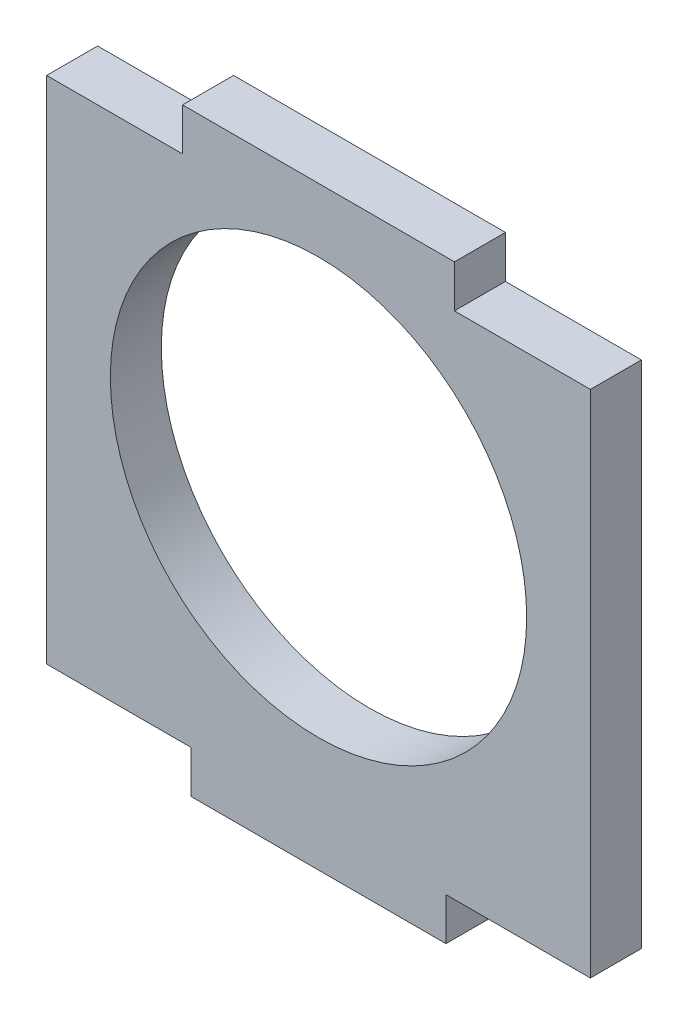
ISO-10303-21;
HEADER;
FILE_DESCRIPTION(('STEP AP214'),'2;1');
FILE_NAME('part.step','',(''),(''),'','','');
FILE_SCHEMA(('AUTOMOTIVE_DESIGN { 1 0 10303 214 1 1 1 1 }'));
ENDSEC;
DATA;
#1=APPLICATION_CONTEXT('core data for automotive mechanical design processes');
#2=APPLICATION_PROTOCOL_DEFINITION('international standard','automotive_design',2000,#1);
#3=PRODUCT_CONTEXT('',#1,'mechanical');
#4=PRODUCT('Part','Part','',(#3));
#5=PRODUCT_RELATED_PRODUCT_CATEGORY('part','',(#4));
#6=PRODUCT_DEFINITION_FORMATION('','',#4);
#7=PRODUCT_DEFINITION_CONTEXT('part definition',#1,'design');
#8=PRODUCT_DEFINITION('design','',#6,#7);
#9=PRODUCT_DEFINITION_SHAPE('','',#8);
#10=(LENGTH_UNIT() NAMED_UNIT(*) SI_UNIT(.MILLI.,.METRE.));
#11=(NAMED_UNIT(*) PLANE_ANGLE_UNIT() SI_UNIT($,.RADIAN.));
#12=(NAMED_UNIT(*) SI_UNIT($,.STERADIAN.) SOLID_ANGLE_UNIT());
#13=UNCERTAINTY_MEASURE_WITH_UNIT(LENGTH_MEASURE(1.E-05),#10,'distance_accuracy_value','');
#14=(GEOMETRIC_REPRESENTATION_CONTEXT(3) GLOBAL_UNCERTAINTY_ASSIGNED_CONTEXT((#13)) GLOBAL_UNIT_ASSIGNED_CONTEXT((#10,
#11,#12)) REPRESENTATION_CONTEXT('',''));
#15=CARTESIAN_POINT('',(0.,0.,0.));
#16=DIRECTION('',(0.,0.,1.));
#17=DIRECTION('',(1.,0.,0.));
#18=AXIS2_PLACEMENT_3D('',#15,#16,#17);
#19=CARTESIAN_POINT('',(0.,0.,3.));
#20=DIRECTION('',(0.,0.,-1.));
#21=DIRECTION('',(-1.,0.,0.));
#22=AXIS2_PLACEMENT_3D('',#19,#20,#21);
#23=PLANE('',#22);
#24=DIRECTION('',(0.,-1.,0.));
#25=VECTOR('',#24,1.);
#26=CARTESIAN_POINT('',(-16.,-15.0000000000005,3.));
#27=LINE('',#26,#25);
#28=CARTESIAN_POINT('',(-16.,14.9999999999996,3.));
#29=VERTEX_POINT('',#28);
#30=CARTESIAN_POINT('',(-16.,-15.0000000000005,3.));
#31=VERTEX_POINT('',#30);
#32=EDGE_CURVE('E177',#29,#31,#27,.T.);
#33=ORIENTED_EDGE('',*,*,#32,.T.);
#34=DIRECTION('',(1.,0.,0.));
#35=VECTOR('',#34,1.);
#36=CARTESIAN_POINT('',(-7.50000000000006,-15.0000000000005,3.));
#37=LINE('',#36,#35);
#38=CARTESIAN_POINT('',(-7.50000000000006,-15.0000000000005,3.));
#39=VERTEX_POINT('',#38);
#40=EDGE_CURVE('E105',#31,#39,#37,.T.);
#41=ORIENTED_EDGE('',*,*,#40,.T.);
#42=DIRECTION('',(0.,-1.,0.));
#43=VECTOR('',#42,1.);
#44=CARTESIAN_POINT('',(-7.50000000000007,-17.5000000000001,3.));
#45=LINE('',#44,#43);
#46=CARTESIAN_POINT('',(-7.50000000000007,-17.5000000000001,3.));
#47=VERTEX_POINT('',#46);
#48=EDGE_CURVE('E204',#39,#47,#45,.T.);
#49=ORIENTED_EDGE('',*,*,#48,.T.);
#50=DIRECTION('',(1.,0.,0.));
#51=VECTOR('',#50,1.);
#52=CARTESIAN_POINT('',(7.49999999999984,-17.5000000000001,3.));
#53=LINE('',#52,#51);
#54=CARTESIAN_POINT('',(7.49999999999984,-17.5000000000001,3.));
#55=VERTEX_POINT('',#54);
#56=EDGE_CURVE('E223',#47,#55,#53,.T.);
#57=ORIENTED_EDGE('',*,*,#56,.T.);
#58=DIRECTION('',(0.,1.,0.));
#59=VECTOR('',#58,1.);
#60=CARTESIAN_POINT('',(7.49999999999984,-17.5000000000001,3.));
#61=LINE('',#60,#59);
#62=CARTESIAN_POINT('',(7.49999999999984,-15.0000000000005,3.));
#63=VERTEX_POINT('',#62);
#64=EDGE_CURVE('E220',#55,#63,#61,.T.);
#65=ORIENTED_EDGE('',*,*,#64,.T.);
#66=DIRECTION('',(1.,0.,0.));
#67=VECTOR('',#66,1.);
#68=CARTESIAN_POINT('',(16.,-15.0000000000005,3.));
#69=LINE('',#68,#67);
#70=CARTESIAN_POINT('',(16.,-15.0000000000005,3.));
#71=VERTEX_POINT('',#70);
#72=EDGE_CURVE('E222',#63,#71,#69,.T.);
#73=ORIENTED_EDGE('',*,*,#72,.T.);
#74=DIRECTION('',(0.,1.,0.));
#75=VECTOR('',#74,1.);
#76=CARTESIAN_POINT('',(16.,14.9999999999996,3.));
#77=LINE('',#76,#75);
#78=CARTESIAN_POINT('',(16.,14.9999999999996,3.));
#79=VERTEX_POINT('',#78);
#80=EDGE_CURVE('E225',#71,#79,#77,.T.);
#81=ORIENTED_EDGE('',*,*,#80,.T.);
#82=DIRECTION('',(-1.,0.,0.));
#83=VECTOR('',#82,1.);
#84=CARTESIAN_POINT('',(8.00000000000001,14.9999999999996,3.));
#85=LINE('',#84,#83);
#86=CARTESIAN_POINT('',(8.00000000000001,14.9999999999996,3.));
#87=VERTEX_POINT('',#86);
#88=EDGE_CURVE('E231',#79,#87,#85,.T.);
#89=ORIENTED_EDGE('',*,*,#88,.T.);
#90=DIRECTION('',(0.,1.,0.));
#91=VECTOR('',#90,1.);
#92=CARTESIAN_POINT('',(8.00000000000001,17.5,3.));
#93=LINE('',#92,#91);
#94=CARTESIAN_POINT('',(8.00000000000001,17.5,3.));
#95=VERTEX_POINT('',#94);
#96=EDGE_CURVE('E136',#87,#95,#93,.T.);
#97=ORIENTED_EDGE('',*,*,#96,.T.);
#98=DIRECTION('',(-1.,0.,0.));
#99=VECTOR('',#98,1.);
#100=CARTESIAN_POINT('',(-8.00000000000001,17.5,3.));
#101=LINE('',#100,#99);
#102=CARTESIAN_POINT('',(-8.00000000000001,17.5,3.));
#103=VERTEX_POINT('',#102);
#104=EDGE_CURVE('E130',#95,#103,#101,.T.);
#105=ORIENTED_EDGE('',*,*,#104,.T.);
#106=DIRECTION('',(0.,-1.,0.));
#107=VECTOR('',#106,1.);
#108=CARTESIAN_POINT('',(-8.00000000000001,17.5,3.));
#109=LINE('',#108,#107);
#110=CARTESIAN_POINT('',(-8.00000000000001,14.9999999999996,3.));
#111=VERTEX_POINT('',#110);
#112=EDGE_CURVE('E134',#103,#111,#109,.T.);
#113=ORIENTED_EDGE('',*,*,#112,.T.);
#114=DIRECTION('',(-1.,0.,0.));
#115=VECTOR('',#114,1.);
#116=CARTESIAN_POINT('',(-16.,14.9999999999996,3.));
#117=LINE('',#116,#115);
#118=EDGE_CURVE('E50',#111,#29,#117,.T.);
#119=ORIENTED_EDGE('',*,*,#118,.T.);
#120=EDGE_LOOP('',(#33,#41,#49,#57,#65,#73,#81,#89,#97,#105,#113,#119));
#121=FACE_BOUND('',#120,.T.);
#122=CARTESIAN_POINT('',(0.,1.4999999999995,3.));
#123=DIRECTION('',(0.,0.,1.));
#124=DIRECTION('',(1.,0.,0.));
#125=AXIS2_PLACEMENT_3D('',#122,#123,#124);
#126=CIRCLE('',#125,12.2500000000001);
#127=CARTESIAN_POINT('',(12.2500000000001,1.4999999999995,3.));
#128=VERTEX_POINT('',#127);
#129=EDGE_CURVE('E158',#128,#128,#126,.T.);
#130=ORIENTED_EDGE('',*,*,#129,.F.);
#131=EDGE_LOOP('',(#130));
#132=FACE_BOUND('',#131,.T.);
#133=ADVANCED_FACE('F33',(#121,#132),#23,.F.);
#134=CARTESIAN_POINT('',(0.,0.,0.));
#135=DIRECTION('',(0.,0.,-1.));
#136=DIRECTION('',(-1.,0.,0.));
#137=AXIS2_PLACEMENT_3D('',#134,#135,#136);
#138=PLANE('',#137);
#139=DIRECTION('',(0.,-1.,0.));
#140=VECTOR('',#139,1.);
#141=CARTESIAN_POINT('',(-16.,-15.0000000000005,0.));
#142=LINE('',#141,#140);
#143=CARTESIAN_POINT('',(-16.,14.9999999999996,0.));
#144=VERTEX_POINT('',#143);
#145=CARTESIAN_POINT('',(-16.,-15.0000000000005,0.));
#146=VERTEX_POINT('',#145);
#147=EDGE_CURVE('E154',#144,#146,#142,.T.);
#148=ORIENTED_EDGE('',*,*,#147,.F.);
#149=DIRECTION('',(-1.,0.,0.));
#150=VECTOR('',#149,1.);
#151=CARTESIAN_POINT('',(-16.,14.9999999999996,0.));
#152=LINE('',#151,#150);
#153=CARTESIAN_POINT('',(-8.00000000000001,14.9999999999996,0.));
#154=VERTEX_POINT('',#153);
#155=EDGE_CURVE('E97',#154,#144,#152,.T.);
#156=ORIENTED_EDGE('',*,*,#155,.F.);
#157=DIRECTION('',(0.,-1.,0.));
#158=VECTOR('',#157,1.);
#159=CARTESIAN_POINT('',(-8.00000000000001,17.5,0.));
#160=LINE('',#159,#158);
#161=CARTESIAN_POINT('',(-8.00000000000001,17.5,0.));
#162=VERTEX_POINT('',#161);
#163=EDGE_CURVE('E91',#162,#154,#160,.T.);
#164=ORIENTED_EDGE('',*,*,#163,.F.);
#165=DIRECTION('',(-1.,0.,0.));
#166=VECTOR('',#165,1.);
#167=CARTESIAN_POINT('',(-8.00000000000001,17.5,0.));
#168=LINE('',#167,#166);
#169=CARTESIAN_POINT('',(8.00000000000001,17.5,0.));
#170=VERTEX_POINT('',#169);
#171=EDGE_CURVE('E144',#170,#162,#168,.T.);
#172=ORIENTED_EDGE('',*,*,#171,.F.);
#173=DIRECTION('',(0.,1.,0.));
#174=VECTOR('',#173,1.);
#175=CARTESIAN_POINT('',(8.00000000000001,17.5,0.));
#176=LINE('',#175,#174);
#177=CARTESIAN_POINT('',(8.00000000000001,14.9999999999996,0.));
#178=VERTEX_POINT('',#177);
#179=EDGE_CURVE('E172',#178,#170,#176,.T.);
#180=ORIENTED_EDGE('',*,*,#179,.F.);
#181=DIRECTION('',(-1.,0.,0.));
#182=VECTOR('',#181,1.);
#183=CARTESIAN_POINT('',(8.00000000000001,14.9999999999996,0.));
#184=LINE('',#183,#182);
#185=CARTESIAN_POINT('',(16.,14.9999999999996,0.));
#186=VERTEX_POINT('',#185);
#187=EDGE_CURVE('E170',#186,#178,#184,.T.);
#188=ORIENTED_EDGE('',*,*,#187,.F.);
#189=DIRECTION('',(0.,1.,0.));
#190=VECTOR('',#189,1.);
#191=CARTESIAN_POINT('',(16.,14.9999999999996,0.));
#192=LINE('',#191,#190);
#193=CARTESIAN_POINT('',(16.,-15.0000000000005,0.));
#194=VERTEX_POINT('',#193);
#195=EDGE_CURVE('E168',#194,#186,#192,.T.);
#196=ORIENTED_EDGE('',*,*,#195,.F.);
#197=DIRECTION('',(1.,0.,0.));
#198=VECTOR('',#197,1.);
#199=CARTESIAN_POINT('',(16.,-15.0000000000005,0.));
#200=LINE('',#199,#198);
#201=CARTESIAN_POINT('',(7.49999999999984,-15.0000000000005,0.));
#202=VERTEX_POINT('',#201);
#203=EDGE_CURVE('E166',#202,#194,#200,.T.);
#204=ORIENTED_EDGE('',*,*,#203,.F.);
#205=DIRECTION('',(0.,1.,0.));
#206=VECTOR('',#205,1.);
#207=CARTESIAN_POINT('',(7.49999999999984,-17.5000000000001,0.));
#208=LINE('',#207,#206);
#209=CARTESIAN_POINT('',(7.49999999999984,-17.5000000000001,0.));
#210=VERTEX_POINT('',#209);
#211=EDGE_CURVE('E164',#210,#202,#208,.T.);
#212=ORIENTED_EDGE('',*,*,#211,.F.);
#213=DIRECTION('',(1.,0.,0.));
#214=VECTOR('',#213,1.);
#215=CARTESIAN_POINT('',(7.49999999999984,-17.5000000000001,0.));
#216=LINE('',#215,#214);
#217=CARTESIAN_POINT('',(-7.50000000000007,-17.5000000000001,0.));
#218=VERTEX_POINT('',#217);
#219=EDGE_CURVE('E162',#218,#210,#216,.T.);
#220=ORIENTED_EDGE('',*,*,#219,.F.);
#221=DIRECTION('',(0.,-1.,0.));
#222=VECTOR('',#221,1.);
#223=CARTESIAN_POINT('',(-7.50000000000007,-17.5000000000001,0.));
#224=LINE('',#223,#222);
#225=CARTESIAN_POINT('',(-7.50000000000006,-15.0000000000005,0.));
#226=VERTEX_POINT('',#225);
#227=EDGE_CURVE('E160',#226,#218,#224,.T.);
#228=ORIENTED_EDGE('',*,*,#227,.F.);
#229=DIRECTION('',(1.,0.,0.));
#230=VECTOR('',#229,1.);
#231=CARTESIAN_POINT('',(-7.50000000000006,-15.0000000000005,0.));
#232=LINE('',#231,#230);
#233=EDGE_CURVE('E157',#146,#226,#232,.T.);
#234=ORIENTED_EDGE('',*,*,#233,.F.);
#235=EDGE_LOOP('',(#148,#156,#164,#172,#180,#188,#196,#204,#212,#220,#228,#234));
#236=FACE_BOUND('',#235,.T.);
#237=CARTESIAN_POINT('',(0.,1.4999999999995,0.));
#238=DIRECTION('',(0.,0.,1.));
#239=DIRECTION('',(1.,0.,0.));
#240=AXIS2_PLACEMENT_3D('',#237,#238,#239);
#241=CIRCLE('',#240,12.2500000000001);
#242=CARTESIAN_POINT('',(12.2500000000001,1.4999999999995,0.));
#243=VERTEX_POINT('',#242);
#244=EDGE_CURVE('E378',#243,#243,#241,.T.);
#245=ORIENTED_EDGE('',*,*,#244,.T.);
#246=EDGE_LOOP('',(#245));
#247=FACE_BOUND('',#246,.T.);
#248=ADVANCED_FACE('F208',(#236,#247),#138,.T.);
#249=CARTESIAN_POINT('',(-16.,-15.0000000000005,3.));
#250=DIRECTION('',(1.,0.,0.));
#251=DIRECTION('',(0.,0.,-1.));
#252=AXIS2_PLACEMENT_3D('',#249,#250,#251);
#253=PLANE('',#252);
#254=ORIENTED_EDGE('',*,*,#147,.T.);
#255=DIRECTION('',(0.,0.,-1.));
#256=VECTOR('',#255,1.);
#257=CARTESIAN_POINT('',(-16.,-15.0000000000005,3.));
#258=LINE('',#257,#256);
#259=EDGE_CURVE('E11',#31,#146,#258,.T.);
#260=ORIENTED_EDGE('',*,*,#259,.F.);
#261=ORIENTED_EDGE('',*,*,#32,.F.);
#262=DIRECTION('',(0.,0.,-1.));
#263=VECTOR('',#262,1.);
#264=CARTESIAN_POINT('',(-16.,14.9999999999996,3.));
#265=LINE('',#264,#263);
#266=EDGE_CURVE('E150',#29,#144,#265,.T.);
#267=ORIENTED_EDGE('',*,*,#266,.T.);
#268=EDGE_LOOP('',(#254,#260,#261,#267));
#269=FACE_BOUND('',#268,.T.);
#270=ADVANCED_FACE('F35',(#269),#253,.F.);
#271=CARTESIAN_POINT('',(-7.50000000000006,-15.0000000000005,3.));
#272=DIRECTION('',(0.,1.,0.));
#273=DIRECTION('',(-1.,0.,0.));
#274=AXIS2_PLACEMENT_3D('',#271,#272,#273);
#275=PLANE('',#274);
#276=ORIENTED_EDGE('',*,*,#233,.T.);
#277=DIRECTION('',(0.,0.,-1.));
#278=VECTOR('',#277,1.);
#279=CARTESIAN_POINT('',(-7.50000000000006,-15.0000000000005,3.));
#280=LINE('',#279,#278);
#281=EDGE_CURVE('E42',#39,#226,#280,.T.);
#282=ORIENTED_EDGE('',*,*,#281,.F.);
#283=ORIENTED_EDGE('',*,*,#40,.F.);
#284=ORIENTED_EDGE('',*,*,#259,.T.);
#285=EDGE_LOOP('',(#276,#282,#283,#284));
#286=FACE_BOUND('',#285,.T.);
#287=ADVANCED_FACE('F265',(#286),#275,.F.);
#288=CARTESIAN_POINT('',(-7.50000000000007,-17.5000000000001,3.));
#289=DIRECTION('',(1.,0.,0.));
#290=DIRECTION('',(0.,1.,0.));
#291=AXIS2_PLACEMENT_3D('',#288,#289,#290);
#292=PLANE('',#291);
#293=ORIENTED_EDGE('',*,*,#227,.T.);
#294=DIRECTION('',(0.,0.,-1.));
#295=VECTOR('',#294,1.);
#296=CARTESIAN_POINT('',(-7.50000000000007,-17.5000000000001,3.));
#297=LINE('',#296,#295);
#298=EDGE_CURVE('E196',#47,#218,#297,.T.);
#299=ORIENTED_EDGE('',*,*,#298,.F.);
#300=ORIENTED_EDGE('',*,*,#48,.F.);
#301=ORIENTED_EDGE('',*,*,#281,.T.);
#302=EDGE_LOOP('',(#293,#299,#300,#301));
#303=FACE_BOUND('',#302,.T.);
#304=ADVANCED_FACE('F202',(#303),#292,.F.);
#305=CARTESIAN_POINT('',(7.49999999999984,-17.5000000000001,3.));
#306=DIRECTION('',(0.,1.,0.));
#307=DIRECTION('',(-1.,0.,0.));
#308=AXIS2_PLACEMENT_3D('',#305,#306,#307);
#309=PLANE('',#308);
#310=ORIENTED_EDGE('',*,*,#219,.T.);
#311=DIRECTION('',(0.,0.,-1.));
#312=VECTOR('',#311,1.);
#313=CARTESIAN_POINT('',(7.49999999999984,-17.5000000000001,3.));
#314=LINE('',#313,#312);
#315=EDGE_CURVE('E193',#55,#210,#314,.T.);
#316=ORIENTED_EDGE('',*,*,#315,.F.);
#317=ORIENTED_EDGE('',*,*,#56,.F.);
#318=ORIENTED_EDGE('',*,*,#298,.T.);
#319=EDGE_LOOP('',(#310,#316,#317,#318));
#320=FACE_BOUND('',#319,.T.);
#321=ADVANCED_FACE('F214',(#320),#309,.F.);
#322=CARTESIAN_POINT('',(7.49999999999984,-17.5000000000001,3.));
#323=DIRECTION('',(-1.,0.,0.));
#324=DIRECTION('',(0.,-1.,0.));
#325=AXIS2_PLACEMENT_3D('',#322,#323,#324);
#326=PLANE('',#325);
#327=ORIENTED_EDGE('',*,*,#211,.T.);
#328=DIRECTION('',(0.,0.,-1.));
#329=VECTOR('',#328,1.);
#330=CARTESIAN_POINT('',(7.49999999999984,-15.0000000000005,3.));
#331=LINE('',#330,#329);
#332=EDGE_CURVE('E190',#63,#202,#331,.T.);
#333=ORIENTED_EDGE('',*,*,#332,.F.);
#334=ORIENTED_EDGE('',*,*,#64,.F.);
#335=ORIENTED_EDGE('',*,*,#315,.T.);
#336=EDGE_LOOP('',(#327,#333,#334,#335));
#337=FACE_BOUND('',#336,.T.);
#338=ADVANCED_FACE('F218',(#337),#326,.F.);
#339=CARTESIAN_POINT('',(16.,-15.0000000000005,3.));
#340=DIRECTION('',(0.,1.,0.));
#341=DIRECTION('',(-1.,0.,0.));
#342=AXIS2_PLACEMENT_3D('',#339,#340,#341);
#343=PLANE('',#342);
#344=ORIENTED_EDGE('',*,*,#203,.T.);
#345=DIRECTION('',(0.,0.,-1.));
#346=VECTOR('',#345,1.);
#347=CARTESIAN_POINT('',(16.,-15.0000000000005,3.));
#348=LINE('',#347,#346);
#349=EDGE_CURVE('E187',#71,#194,#348,.T.);
#350=ORIENTED_EDGE('',*,*,#349,.F.);
#351=ORIENTED_EDGE('',*,*,#72,.F.);
#352=ORIENTED_EDGE('',*,*,#332,.T.);
#353=EDGE_LOOP('',(#344,#350,#351,#352));
#354=FACE_BOUND('',#353,.T.);
#355=ADVANCED_FACE('F278',(#354),#343,.F.);
#356=CARTESIAN_POINT('',(16.,14.9999999999996,3.));
#357=DIRECTION('',(-1.,0.,0.));
#358=DIRECTION('',(0.,-1.,0.));
#359=AXIS2_PLACEMENT_3D('',#356,#357,#358);
#360=PLANE('',#359);
#361=ORIENTED_EDGE('',*,*,#195,.T.);
#362=DIRECTION('',(0.,0.,-1.));
#363=VECTOR('',#362,1.);
#364=CARTESIAN_POINT('',(16.,14.9999999999996,3.));
#365=LINE('',#364,#363);
#366=EDGE_CURVE('E184',#79,#186,#365,.T.);
#367=ORIENTED_EDGE('',*,*,#366,.F.);
#368=ORIENTED_EDGE('',*,*,#80,.F.);
#369=ORIENTED_EDGE('',*,*,#349,.T.);
#370=EDGE_LOOP('',(#361,#367,#368,#369));
#371=FACE_BOUND('',#370,.T.);
#372=ADVANCED_FACE('F281',(#371),#360,.F.);
#373=CARTESIAN_POINT('',(8.00000000000001,14.9999999999996,3.));
#374=DIRECTION('',(0.,-1.,0.));
#375=DIRECTION('',(0.,0.,-1.));
#376=AXIS2_PLACEMENT_3D('',#373,#374,#375);
#377=PLANE('',#376);
#378=ORIENTED_EDGE('',*,*,#187,.T.);
#379=DIRECTION('',(0.,0.,-1.));
#380=VECTOR('',#379,1.);
#381=CARTESIAN_POINT('',(8.00000000000001,14.9999999999996,3.));
#382=LINE('',#381,#380);
#383=EDGE_CURVE('E181',#87,#178,#382,.T.);
#384=ORIENTED_EDGE('',*,*,#383,.F.);
#385=ORIENTED_EDGE('',*,*,#88,.F.);
#386=ORIENTED_EDGE('',*,*,#366,.T.);
#387=EDGE_LOOP('',(#378,#384,#385,#386));
#388=FACE_BOUND('',#387,.T.);
#389=ADVANCED_FACE('F237',(#388),#377,.F.);
#390=CARTESIAN_POINT('',(8.00000000000001,17.5,3.));
#391=DIRECTION('',(-1.,0.,0.));
#392=DIRECTION('',(0.,0.,1.));
#393=AXIS2_PLACEMENT_3D('',#390,#391,#392);
#394=PLANE('',#393);
#395=ORIENTED_EDGE('',*,*,#179,.T.);
#396=DIRECTION('',(0.,0.,-1.));
#397=VECTOR('',#396,1.);
#398=CARTESIAN_POINT('',(8.00000000000001,17.5,3.));
#399=LINE('',#398,#397);
#400=EDGE_CURVE('E145',#95,#170,#399,.T.);
#401=ORIENTED_EDGE('',*,*,#400,.F.);
#402=ORIENTED_EDGE('',*,*,#96,.F.);
#403=ORIENTED_EDGE('',*,*,#383,.T.);
#404=EDGE_LOOP('',(#395,#401,#402,#403));
#405=FACE_BOUND('',#404,.T.);
#406=ADVANCED_FACE('F241',(#405),#394,.F.);
#407=CARTESIAN_POINT('',(-8.00000000000001,17.5,3.));
#408=DIRECTION('',(0.,-1.,0.));
#409=DIRECTION('',(0.,0.,-1.));
#410=AXIS2_PLACEMENT_3D('',#407,#408,#409);
#411=PLANE('',#410);
#412=ORIENTED_EDGE('',*,*,#171,.T.);
#413=DIRECTION('',(0.,0.,-1.));
#414=VECTOR('',#413,1.);
#415=CARTESIAN_POINT('',(-8.00000000000001,17.5,3.));
#416=LINE('',#415,#414);
#417=EDGE_CURVE('E141',#103,#162,#416,.T.);
#418=ORIENTED_EDGE('',*,*,#417,.F.);
#419=ORIENTED_EDGE('',*,*,#104,.F.);
#420=ORIENTED_EDGE('',*,*,#400,.T.);
#421=EDGE_LOOP('',(#412,#418,#419,#420));
#422=FACE_BOUND('',#421,.T.);
#423=ADVANCED_FACE('F142',(#422),#411,.F.);
#424=CARTESIAN_POINT('',(-8.00000000000001,17.5,3.));
#425=DIRECTION('',(1.,0.,0.));
#426=DIRECTION('',(0.,0.,-1.));
#427=AXIS2_PLACEMENT_3D('',#424,#425,#426);
#428=PLANE('',#427);
#429=ORIENTED_EDGE('',*,*,#163,.T.);
#430=DIRECTION('',(0.,0.,-1.));
#431=VECTOR('',#430,1.);
#432=CARTESIAN_POINT('',(-8.00000000000001,14.9999999999996,3.));
#433=LINE('',#432,#431);
#434=EDGE_CURVE('E146',#111,#154,#433,.T.);
#435=ORIENTED_EDGE('',*,*,#434,.F.);
#436=ORIENTED_EDGE('',*,*,#112,.F.);
#437=ORIENTED_EDGE('',*,*,#417,.T.);
#438=EDGE_LOOP('',(#429,#435,#436,#437));
#439=FACE_BOUND('',#438,.T.);
#440=ADVANCED_FACE('F148',(#439),#428,.F.);
#441=CARTESIAN_POINT('',(-16.,14.9999999999996,3.));
#442=DIRECTION('',(0.,-1.,0.));
#443=DIRECTION('',(0.,0.,-1.));
#444=AXIS2_PLACEMENT_3D('',#441,#442,#443);
#445=PLANE('',#444);
#446=ORIENTED_EDGE('',*,*,#155,.T.);
#447=ORIENTED_EDGE('',*,*,#266,.F.);
#448=ORIENTED_EDGE('',*,*,#118,.F.);
#449=ORIENTED_EDGE('',*,*,#434,.T.);
#450=EDGE_LOOP('',(#446,#447,#448,#449));
#451=FACE_BOUND('',#450,.T.);
#452=ADVANCED_FACE('F245',(#451),#445,.F.);
#453=CARTESIAN_POINT('',(0.,1.4999999999995,3.));
#454=DIRECTION('',(0.,0.,-1.));
#455=DIRECTION('',(-1.,0.,0.));
#456=AXIS2_PLACEMENT_3D('',#453,#454,#455);
#457=CYLINDRICAL_SURFACE('',#456,12.2500000000001);
#458=ORIENTED_EDGE('',*,*,#129,.T.);
#459=EDGE_LOOP('',(#458));
#460=FACE_BOUND('',#459,.T.);
#461=ORIENTED_EDGE('',*,*,#244,.F.);
#462=EDGE_LOOP('',(#461));
#463=FACE_BOUND('',#462,.T.);
#464=ADVANCED_FACE('F247',(#460,#463),#457,.F.);
#465=CLOSED_SHELL('',(#133,#248,#270,#287,#304,#321,#338,#355,#372,#389,#406,#423,#440,#452,#464));
#466=MANIFOLD_SOLID_BREP('B2',#465);
#467=ADVANCED_BREP_SHAPE_REPRESENTATION('',(#18,#466),#14);
#468=SHAPE_DEFINITION_REPRESENTATION(#9,#467);
ENDSEC;
END-ISO-10303-21;
